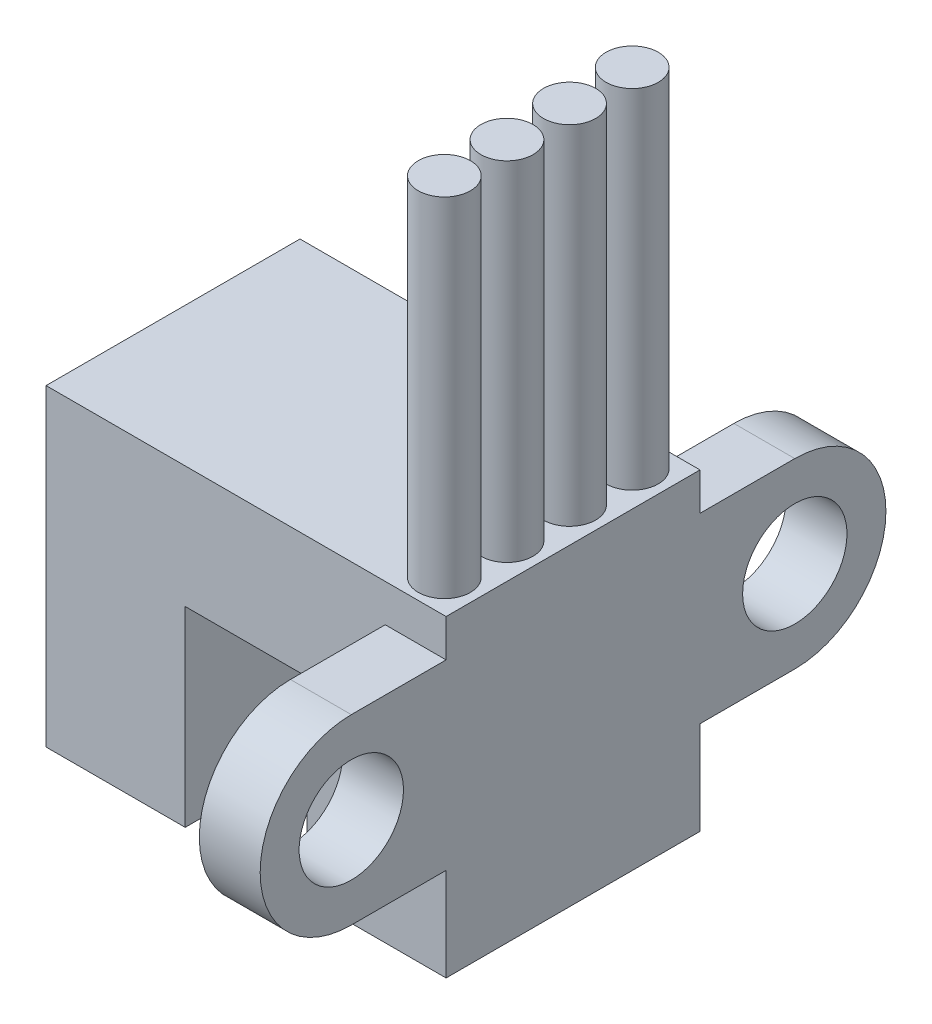
ISO-10303-21;
HEADER;
FILE_DESCRIPTION(('STEP AP214'),'2;1');
FILE_NAME('part.step','',(''),(''),'','','');
FILE_SCHEMA(('AUTOMOTIVE_DESIGN { 1 0 10303 214 1 1 1 1 }'));
ENDSEC;
DATA;
#1=APPLICATION_CONTEXT('core data for automotive mechanical design processes');
#2=APPLICATION_PROTOCOL_DEFINITION('international standard','automotive_design',2000,#1);
#3=PRODUCT_CONTEXT('',#1,'mechanical');
#4=PRODUCT('Part','Part','',(#3));
#5=PRODUCT_RELATED_PRODUCT_CATEGORY('part','',(#4));
#6=PRODUCT_DEFINITION_FORMATION('','',#4);
#7=PRODUCT_DEFINITION_CONTEXT('part definition',#1,'design');
#8=PRODUCT_DEFINITION('design','',#6,#7);
#9=PRODUCT_DEFINITION_SHAPE('','',#8);
#10=(LENGTH_UNIT() NAMED_UNIT(*) SI_UNIT(.MILLI.,.METRE.));
#11=(NAMED_UNIT(*) PLANE_ANGLE_UNIT() SI_UNIT($,.RADIAN.));
#12=(NAMED_UNIT(*) SI_UNIT($,.STERADIAN.) SOLID_ANGLE_UNIT());
#13=UNCERTAINTY_MEASURE_WITH_UNIT(LENGTH_MEASURE(1.E-05),#10,'distance_accuracy_value','');
#14=(GEOMETRIC_REPRESENTATION_CONTEXT(3) GLOBAL_UNCERTAINTY_ASSIGNED_CONTEXT((#13)) GLOBAL_UNIT_ASSIGNED_CONTEXT((#10,
#11,#12)) REPRESENTATION_CONTEXT('',''));
#15=CARTESIAN_POINT('',(0.,0.,0.));
#16=DIRECTION('',(0.,0.,1.));
#17=DIRECTION('',(1.,0.,0.));
#18=AXIS2_PLACEMENT_3D('',#15,#16,#17);
#19=CARTESIAN_POINT('',(0.,0.,3.65));
#20=DIRECTION('',(0.,0.,-1.));
#21=DIRECTION('',(-1.,0.,0.));
#22=AXIS2_PLACEMENT_3D('',#19,#20,#21);
#23=PLANE('',#22);
#24=DIRECTION('',(1.,0.,0.));
#25=VECTOR('',#24,1.);
#26=CARTESIAN_POINT('',(4.,-2.82,3.65));
#27=LINE('',#26,#25);
#28=CARTESIAN_POINT('',(4.,-2.82,3.65));
#29=VERTEX_POINT('',#28);
#30=CARTESIAN_POINT('',(5.75,-2.82,3.65));
#31=VERTEX_POINT('',#30);
#32=EDGE_CURVE('E218',#29,#31,#27,.T.);
#33=ORIENTED_EDGE('',*,*,#32,.F.);
#34=DIRECTION('',(0.,1.,0.));
#35=VECTOR('',#34,1.);
#36=CARTESIAN_POINT('',(4.,-2.82,3.65));
#37=LINE('',#36,#35);
#38=CARTESIAN_POINT('',(4.,2.42,3.65));
#39=VERTEX_POINT('',#38);
#40=EDGE_CURVE('E200',#29,#39,#37,.T.);
#41=ORIENTED_EDGE('',*,*,#40,.T.);
#42=DIRECTION('',(1.,0.,0.));
#43=VECTOR('',#42,1.);
#44=CARTESIAN_POINT('',(4.,2.42,3.65));
#45=LINE('',#44,#43);
#46=CARTESIAN_POINT('',(5.75,2.42,3.65));
#47=VERTEX_POINT('',#46);
#48=EDGE_CURVE('E216',#39,#47,#45,.T.);
#49=ORIENTED_EDGE('',*,*,#48,.T.);
#50=DIRECTION('',(0.,1.,0.));
#51=VECTOR('',#50,1.);
#52=CARTESIAN_POINT('',(5.75,-5.5,3.65));
#53=LINE('',#52,#51);
#54=CARTESIAN_POINT('',(5.75,3.5,3.65));
#55=VERTEX_POINT('',#54);
#56=EDGE_CURVE('E231',#47,#55,#53,.T.);
#57=ORIENTED_EDGE('',*,*,#56,.T.);
#58=DIRECTION('',(-1.,0.,0.));
#59=VECTOR('',#58,1.);
#60=CARTESIAN_POINT('',(-5.75,3.5,3.65));
#61=LINE('',#60,#59);
#62=CARTESIAN_POINT('',(-5.75,3.5,3.65));
#63=VERTEX_POINT('',#62);
#64=EDGE_CURVE('E235',#55,#63,#61,.T.);
#65=ORIENTED_EDGE('',*,*,#64,.T.);
#66=DIRECTION('',(0.,-1.,0.));
#67=VECTOR('',#66,1.);
#68=CARTESIAN_POINT('',(-5.75,-5.5,3.65));
#69=LINE('',#68,#67);
#70=CARTESIAN_POINT('',(-5.75,-5.5,3.65));
#71=VERTEX_POINT('',#70);
#72=EDGE_CURVE('E237',#63,#71,#69,.T.);
#73=ORIENTED_EDGE('',*,*,#72,.T.);
#74=DIRECTION('',(1.,0.,0.));
#75=VECTOR('',#74,1.);
#76=CARTESIAN_POINT('',(-1.75,-5.5,3.65));
#77=LINE('',#76,#75);
#78=CARTESIAN_POINT('',(-1.75,-5.5,3.65));
#79=VERTEX_POINT('',#78);
#80=EDGE_CURVE('E239',#71,#79,#77,.T.);
#81=ORIENTED_EDGE('',*,*,#80,.T.);
#82=DIRECTION('',(0.,1.,0.));
#83=VECTOR('',#82,1.);
#84=CARTESIAN_POINT('',(-1.75,0.,3.65));
#85=LINE('',#84,#83);
#86=CARTESIAN_POINT('',(-1.75,0.,3.65));
#87=VERTEX_POINT('',#86);
#88=EDGE_CURVE('E221',#79,#87,#85,.T.);
#89=ORIENTED_EDGE('',*,*,#88,.T.);
#90=DIRECTION('',(1.,0.,0.));
#91=VECTOR('',#90,1.);
#92=CARTESIAN_POINT('',(1.75,0.,3.65));
#93=LINE('',#92,#91);
#94=CARTESIAN_POINT('',(1.75,0.,3.65));
#95=VERTEX_POINT('',#94);
#96=EDGE_CURVE('E224',#87,#95,#93,.T.);
#97=ORIENTED_EDGE('',*,*,#96,.T.);
#98=DIRECTION('',(0.,-1.,0.));
#99=VECTOR('',#98,1.);
#100=CARTESIAN_POINT('',(1.75,0.,3.65));
#101=LINE('',#100,#99);
#102=CARTESIAN_POINT('',(1.75,-5.5,3.65));
#103=VERTEX_POINT('',#102);
#104=EDGE_CURVE('E227',#95,#103,#101,.T.);
#105=ORIENTED_EDGE('',*,*,#104,.T.);
#106=DIRECTION('',(1.,0.,0.));
#107=VECTOR('',#106,1.);
#108=CARTESIAN_POINT('',(1.75,-5.5,3.65));
#109=LINE('',#108,#107);
#110=CARTESIAN_POINT('',(5.75,-5.5,3.65));
#111=VERTEX_POINT('',#110);
#112=EDGE_CURVE('E229',#103,#111,#109,.T.);
#113=ORIENTED_EDGE('',*,*,#112,.T.);
#114=EDGE_CURVE('E232',#111,#31,#53,.T.);
#115=ORIENTED_EDGE('',*,*,#114,.T.);
#116=EDGE_LOOP('',(#33,#41,#49,#57,#65,#73,#81,#89,#97,#105,#113,#115));
#117=FACE_BOUND('',#116,.T.);
#118=ADVANCED_FACE('F32',(#117),#23,.F.);
#119=CARTESIAN_POINT('',(-1.75,0.,3.65));
#120=DIRECTION('',(-1.,0.,0.));
#121=DIRECTION('',(0.,-1.,0.));
#122=AXIS2_PLACEMENT_3D('',#119,#120,#121);
#123=PLANE('',#122);
#124=DIRECTION('',(0.,1.,0.));
#125=VECTOR('',#124,1.);
#126=CARTESIAN_POINT('',(-1.75,0.,-3.65));
#127=LINE('',#126,#125);
#128=CARTESIAN_POINT('',(-1.75,-5.5,-3.65));
#129=VERTEX_POINT('',#128);
#130=CARTESIAN_POINT('',(-1.75,0.,-3.65));
#131=VERTEX_POINT('',#130);
#132=EDGE_CURVE('E215',#129,#131,#127,.T.);
#133=ORIENTED_EDGE('',*,*,#132,.T.);
#134=DIRECTION('',(0.,0.,-1.));
#135=VECTOR('',#134,1.);
#136=CARTESIAN_POINT('',(-1.75,0.,3.65));
#137=LINE('',#136,#135);
#138=EDGE_CURVE('E279',#87,#131,#137,.T.);
#139=ORIENTED_EDGE('',*,*,#138,.F.);
#140=ORIENTED_EDGE('',*,*,#88,.F.);
#141=DIRECTION('',(0.,0.,-1.));
#142=VECTOR('',#141,1.);
#143=CARTESIAN_POINT('',(-1.75,-5.5,3.65));
#144=LINE('',#143,#142);
#145=EDGE_CURVE('E241',#79,#129,#144,.T.);
#146=ORIENTED_EDGE('',*,*,#145,.T.);
#147=EDGE_LOOP('',(#133,#139,#140,#146));
#148=FACE_BOUND('',#147,.T.);
#149=ADVANCED_FACE('F34',(#148),#123,.F.);
#150=CARTESIAN_POINT('',(1.75,0.,3.65));
#151=DIRECTION('',(0.,1.,0.));
#152=DIRECTION('',(0.,0.,1.));
#153=AXIS2_PLACEMENT_3D('',#150,#151,#152);
#154=PLANE('',#153);
#155=DIRECTION('',(1.,0.,0.));
#156=VECTOR('',#155,1.);
#157=CARTESIAN_POINT('',(1.75,0.,-3.65));
#158=LINE('',#157,#156);
#159=CARTESIAN_POINT('',(1.75,0.,-3.65));
#160=VERTEX_POINT('',#159);
#161=EDGE_CURVE('E244',#131,#160,#158,.T.);
#162=ORIENTED_EDGE('',*,*,#161,.T.);
#163=DIRECTION('',(0.,0.,-1.));
#164=VECTOR('',#163,1.);
#165=CARTESIAN_POINT('',(1.75,0.,3.65));
#166=LINE('',#165,#164);
#167=EDGE_CURVE('E276',#95,#160,#166,.T.);
#168=ORIENTED_EDGE('',*,*,#167,.F.);
#169=ORIENTED_EDGE('',*,*,#96,.F.);
#170=ORIENTED_EDGE('',*,*,#138,.T.);
#171=EDGE_LOOP('',(#162,#168,#169,#170));
#172=FACE_BOUND('',#171,.T.);
#173=ADVANCED_FACE('F342',(#172),#154,.F.);
#174=CARTESIAN_POINT('',(1.75,0.,3.65));
#175=DIRECTION('',(1.,0.,0.));
#176=DIRECTION('',(0.,1.,0.));
#177=AXIS2_PLACEMENT_3D('',#174,#175,#176);
#178=PLANE('',#177);
#179=DIRECTION('',(0.,-1.,0.));
#180=VECTOR('',#179,1.);
#181=CARTESIAN_POINT('',(1.75,0.,-3.65));
#182=LINE('',#181,#180);
#183=CARTESIAN_POINT('',(1.75,-5.5,-3.65));
#184=VERTEX_POINT('',#183);
#185=EDGE_CURVE('E246',#160,#184,#182,.T.);
#186=ORIENTED_EDGE('',*,*,#185,.T.);
#187=DIRECTION('',(0.,0.,-1.));
#188=VECTOR('',#187,1.);
#189=CARTESIAN_POINT('',(1.75,-5.5,3.65));
#190=LINE('',#189,#188);
#191=EDGE_CURVE('E273',#103,#184,#190,.T.);
#192=ORIENTED_EDGE('',*,*,#191,.F.);
#193=ORIENTED_EDGE('',*,*,#104,.F.);
#194=ORIENTED_EDGE('',*,*,#167,.T.);
#195=EDGE_LOOP('',(#186,#192,#193,#194));
#196=FACE_BOUND('',#195,.T.);
#197=ADVANCED_FACE('F339',(#196),#178,.F.);
#198=CARTESIAN_POINT('',(1.75,-5.5,3.65));
#199=DIRECTION('',(0.,1.,0.));
#200=DIRECTION('',(-1.,0.,0.));
#201=AXIS2_PLACEMENT_3D('',#198,#199,#200);
#202=PLANE('',#201);
#203=DIRECTION('',(1.,0.,0.));
#204=VECTOR('',#203,1.);
#205=CARTESIAN_POINT('',(1.75,-5.5,-3.65));
#206=LINE('',#205,#204);
#207=CARTESIAN_POINT('',(5.75,-5.5,-3.65));
#208=VERTEX_POINT('',#207);
#209=EDGE_CURVE('E248',#184,#208,#206,.T.);
#210=ORIENTED_EDGE('',*,*,#209,.T.);
#211=DIRECTION('',(0.,0.,-1.));
#212=VECTOR('',#211,1.);
#213=CARTESIAN_POINT('',(5.75,-5.5,3.65));
#214=LINE('',#213,#212);
#215=EDGE_CURVE('E270',#111,#208,#214,.T.);
#216=ORIENTED_EDGE('',*,*,#215,.F.);
#217=ORIENTED_EDGE('',*,*,#112,.F.);
#218=ORIENTED_EDGE('',*,*,#191,.T.);
#219=EDGE_LOOP('',(#210,#216,#217,#218));
#220=FACE_BOUND('',#219,.T.);
#221=ADVANCED_FACE('F335',(#220),#202,.F.);
#222=CARTESIAN_POINT('',(5.75,-5.5,3.65));
#223=DIRECTION('',(-1.,0.,0.));
#224=DIRECTION('',(0.,0.,1.));
#225=AXIS2_PLACEMENT_3D('',#222,#223,#224);
#226=PLANE('',#225);
#227=DIRECTION('',(0.,1.,0.));
#228=VECTOR('',#227,1.);
#229=CARTESIAN_POINT('',(5.75,-5.5,-3.65));
#230=LINE('',#229,#228);
#231=CARTESIAN_POINT('',(5.75,-2.82,-3.65));
#232=VERTEX_POINT('',#231);
#233=EDGE_CURVE('E251',#208,#232,#230,.T.);
#234=ORIENTED_EDGE('',*,*,#233,.T.);
#235=DIRECTION('',(0.,0.,1.));
#236=VECTOR('',#235,1.);
#237=CARTESIAN_POINT('',(5.75,-2.82,-6.375));
#238=LINE('',#237,#236);
#239=CARTESIAN_POINT('',(5.75,-2.82,-6.375));
#240=VERTEX_POINT('',#239);
#241=EDGE_CURVE('E47',#240,#232,#238,.T.);
#242=ORIENTED_EDGE('',*,*,#241,.F.);
#243=CARTESIAN_POINT('',(5.75,-0.200000000000001,-6.375));
#244=DIRECTION('',(-1.,0.,0.));
#245=DIRECTION('',(0.,0.,1.));
#246=AXIS2_PLACEMENT_3D('',#243,#244,#245);
#247=CIRCLE('',#246,2.62);
#248=CARTESIAN_POINT('',(5.75,2.42,-6.375));
#249=VERTEX_POINT('',#248);
#250=EDGE_CURVE('E179',#249,#240,#247,.T.);
#251=ORIENTED_EDGE('',*,*,#250,.F.);
#252=DIRECTION('',(0.,0.,-1.));
#253=VECTOR('',#252,1.);
#254=CARTESIAN_POINT('',(5.75,2.42,-6.375));
#255=LINE('',#254,#253);
#256=CARTESIAN_POINT('',(5.75,2.42,-3.65));
#257=VERTEX_POINT('',#256);
#258=EDGE_CURVE('E162',#257,#249,#255,.T.);
#259=ORIENTED_EDGE('',*,*,#258,.F.);
#260=CARTESIAN_POINT('',(5.75,3.5,-3.65));
#261=VERTEX_POINT('',#260);
#262=EDGE_CURVE('E250',#257,#261,#230,.T.);
#263=ORIENTED_EDGE('',*,*,#262,.T.);
#264=DIRECTION('',(0.,0.,-1.));
#265=VECTOR('',#264,1.);
#266=CARTESIAN_POINT('',(5.75,3.5,3.65));
#267=LINE('',#266,#265);
#268=EDGE_CURVE('E267',#55,#261,#267,.T.);
#269=ORIENTED_EDGE('',*,*,#268,.F.);
#270=ORIENTED_EDGE('',*,*,#56,.F.);
#271=DIRECTION('',(0.,0.,1.));
#272=VECTOR('',#271,1.);
#273=CARTESIAN_POINT('',(5.75,2.42,6.375));
#274=LINE('',#273,#272);
#275=CARTESIAN_POINT('',(5.75,2.42,6.375));
#276=VERTEX_POINT('',#275);
#277=EDGE_CURVE('E55',#47,#276,#274,.T.);
#278=ORIENTED_EDGE('',*,*,#277,.T.);
#279=CARTESIAN_POINT('',(5.75,-0.200000000000001,6.375));
#280=DIRECTION('',(1.,0.,0.));
#281=DIRECTION('',(0.,0.,-1.));
#282=AXIS2_PLACEMENT_3D('',#279,#280,#281);
#283=CIRCLE('',#282,2.62);
#284=CARTESIAN_POINT('',(5.75,-2.82,6.375));
#285=VERTEX_POINT('',#284);
#286=EDGE_CURVE('E191',#276,#285,#283,.T.);
#287=ORIENTED_EDGE('',*,*,#286,.T.);
#288=DIRECTION('',(0.,0.,-1.));
#289=VECTOR('',#288,1.);
#290=CARTESIAN_POINT('',(5.75,-2.82,6.375));
#291=LINE('',#290,#289);
#292=EDGE_CURVE('E209',#285,#31,#291,.T.);
#293=ORIENTED_EDGE('',*,*,#292,.T.);
#294=ORIENTED_EDGE('',*,*,#114,.F.);
#295=ORIENTED_EDGE('',*,*,#215,.T.);
#296=EDGE_LOOP('',(#234,#242,#251,#259,#263,#269,#270,#278,#287,#293,#294,#295));
#297=FACE_BOUND('',#296,.T.);
#298=CARTESIAN_POINT('',(5.75,-0.200000000000001,6.375));
#299=DIRECTION('',(1.,0.,0.));
#300=DIRECTION('',(0.,0.,-1.));
#301=AXIS2_PLACEMENT_3D('',#298,#299,#300);
#302=CIRCLE('',#301,1.5);
#303=CARTESIAN_POINT('',(5.75,-0.200000000000001,4.875));
#304=VERTEX_POINT('',#303);
#305=EDGE_CURVE('E184',#304,#304,#302,.T.);
#306=ORIENTED_EDGE('',*,*,#305,.F.);
#307=EDGE_LOOP('',(#306));
#308=FACE_BOUND('',#307,.T.);
#309=CARTESIAN_POINT('',(5.75,-0.200000000000001,-6.375));
#310=DIRECTION('',(-1.,0.,0.));
#311=DIRECTION('',(0.,0.,1.));
#312=AXIS2_PLACEMENT_3D('',#309,#310,#311);
#313=CIRCLE('',#312,1.5);
#314=CARTESIAN_POINT('',(5.75,-0.200000000000001,-4.875));
#315=VERTEX_POINT('',#314);
#316=EDGE_CURVE('E174',#315,#315,#313,.T.);
#317=ORIENTED_EDGE('',*,*,#316,.T.);
#318=EDGE_LOOP('',(#317));
#319=FACE_BOUND('',#318,.T.);
#320=ADVANCED_FACE('F296',(#297,#308,#319),#226,.F.);
#321=CARTESIAN_POINT('',(-5.75,3.5,3.65));
#322=DIRECTION('',(0.,-1.,0.));
#323=DIRECTION('',(1.,0.,0.));
#324=AXIS2_PLACEMENT_3D('',#321,#322,#323);
#325=PLANE('',#324);
#326=CARTESIAN_POINT('',(4.75,3.5,2.7));
#327=DIRECTION('',(0.,-1.,0.));
#328=DIRECTION('',(1.,0.,0.));
#329=AXIS2_PLACEMENT_3D('',#326,#327,#328);
#330=CIRCLE('',#329,0.750000000000001);
#331=CARTESIAN_POINT('',(5.5,3.5,2.7));
#332=VERTEX_POINT('',#331);
#333=EDGE_CURVE('E11',#332,#332,#330,.F.);
#334=ORIENTED_EDGE('',*,*,#333,.F.);
#335=EDGE_LOOP('',(#334));
#336=FACE_BOUND('',#335,.T.);
#337=CARTESIAN_POINT('',(4.75,3.5,0.9));
#338=DIRECTION('',(0.,-1.,0.));
#339=DIRECTION('',(1.,0.,0.));
#340=AXIS2_PLACEMENT_3D('',#337,#338,#339);
#341=CIRCLE('',#340,0.75);
#342=CARTESIAN_POINT('',(5.5,3.5,0.9));
#343=VERTEX_POINT('',#342);
#344=EDGE_CURVE('E40',#343,#343,#341,.F.);
#345=ORIENTED_EDGE('',*,*,#344,.F.);
#346=EDGE_LOOP('',(#345));
#347=FACE_BOUND('',#346,.T.);
#348=CARTESIAN_POINT('',(4.75,3.5,-0.9));
#349=DIRECTION('',(0.,-1.,0.));
#350=DIRECTION('',(1.,0.,0.));
#351=AXIS2_PLACEMENT_3D('',#348,#349,#350);
#352=CIRCLE('',#351,0.75);
#353=CARTESIAN_POINT('',(5.5,3.5,-0.9));
#354=VERTEX_POINT('',#353);
#355=EDGE_CURVE('E285',#354,#354,#352,.F.);
#356=ORIENTED_EDGE('',*,*,#355,.F.);
#357=EDGE_LOOP('',(#356));
#358=FACE_BOUND('',#357,.T.);
#359=CARTESIAN_POINT('',(4.75,3.5,-2.7));
#360=DIRECTION('',(0.,-1.,0.));
#361=DIRECTION('',(1.,0.,0.));
#362=AXIS2_PLACEMENT_3D('',#359,#360,#361);
#363=CIRCLE('',#362,0.750000000000001);
#364=CARTESIAN_POINT('',(5.5,3.5,-2.7));
#365=VERTEX_POINT('',#364);
#366=EDGE_CURVE('E282',#365,#365,#363,.F.);
#367=ORIENTED_EDGE('',*,*,#366,.F.);
#368=EDGE_LOOP('',(#367));
#369=FACE_BOUND('',#368,.T.);
#370=DIRECTION('',(-1.,0.,0.));
#371=VECTOR('',#370,1.);
#372=CARTESIAN_POINT('',(-5.75,3.5,-3.65));
#373=LINE('',#372,#371);
#374=CARTESIAN_POINT('',(-5.75,3.5,-3.65));
#375=VERTEX_POINT('',#374);
#376=EDGE_CURVE('E254',#261,#375,#373,.T.);
#377=ORIENTED_EDGE('',*,*,#376,.T.);
#378=DIRECTION('',(0.,0.,-1.));
#379=VECTOR('',#378,1.);
#380=CARTESIAN_POINT('',(-5.75,3.5,3.65));
#381=LINE('',#380,#379);
#382=EDGE_CURVE('E264',#63,#375,#381,.T.);
#383=ORIENTED_EDGE('',*,*,#382,.F.);
#384=ORIENTED_EDGE('',*,*,#64,.F.);
#385=ORIENTED_EDGE('',*,*,#268,.T.);
#386=EDGE_LOOP('',(#377,#383,#384,#385));
#387=FACE_BOUND('',#386,.T.);
#388=ADVANCED_FACE('F292',(#336,#347,#358,#369,#387),#325,.F.);
#389=CARTESIAN_POINT('',(-5.75,-5.5,3.65));
#390=DIRECTION('',(1.,0.,0.));
#391=DIRECTION('',(0.,0.,-1.));
#392=AXIS2_PLACEMENT_3D('',#389,#390,#391);
#393=PLANE('',#392);
#394=DIRECTION('',(0.,-1.,0.));
#395=VECTOR('',#394,1.);
#396=CARTESIAN_POINT('',(-5.75,-5.5,-3.65));
#397=LINE('',#396,#395);
#398=CARTESIAN_POINT('',(-5.75,-5.5,-3.65));
#399=VERTEX_POINT('',#398);
#400=EDGE_CURVE('E256',#375,#399,#397,.T.);
#401=ORIENTED_EDGE('',*,*,#400,.T.);
#402=DIRECTION('',(0.,0.,-1.));
#403=VECTOR('',#402,1.);
#404=CARTESIAN_POINT('',(-5.75,-5.5,3.65));
#405=LINE('',#404,#403);
#406=EDGE_CURVE('E261',#71,#399,#405,.T.);
#407=ORIENTED_EDGE('',*,*,#406,.F.);
#408=ORIENTED_EDGE('',*,*,#72,.F.);
#409=ORIENTED_EDGE('',*,*,#382,.T.);
#410=EDGE_LOOP('',(#401,#407,#408,#409));
#411=FACE_BOUND('',#410,.T.);
#412=ADVANCED_FACE('F295',(#411),#393,.F.);
#413=CARTESIAN_POINT('',(-1.75,-5.5,3.65));
#414=DIRECTION('',(0.,1.,0.));
#415=DIRECTION('',(-1.,0.,0.));
#416=AXIS2_PLACEMENT_3D('',#413,#414,#415);
#417=PLANE('',#416);
#418=DIRECTION('',(1.,0.,0.));
#419=VECTOR('',#418,1.);
#420=CARTESIAN_POINT('',(-1.75,-5.5,-3.65));
#421=LINE('',#420,#419);
#422=EDGE_CURVE('E225',#399,#129,#421,.T.);
#423=ORIENTED_EDGE('',*,*,#422,.T.);
#424=ORIENTED_EDGE('',*,*,#145,.F.);
#425=ORIENTED_EDGE('',*,*,#80,.F.);
#426=ORIENTED_EDGE('',*,*,#406,.T.);
#427=EDGE_LOOP('',(#423,#424,#425,#426));
#428=FACE_BOUND('',#427,.T.);
#429=ADVANCED_FACE('F318',(#428),#417,.F.);
#430=CARTESIAN_POINT('',(0.,0.,-3.65));
#431=DIRECTION('',(0.,0.,-1.));
#432=DIRECTION('',(-1.,0.,0.));
#433=AXIS2_PLACEMENT_3D('',#430,#431,#432);
#434=PLANE('',#433);
#435=DIRECTION('',(1.,0.,0.));
#436=VECTOR('',#435,1.);
#437=CARTESIAN_POINT('',(4.,2.42,-3.65));
#438=LINE('',#437,#436);
#439=CARTESIAN_POINT('',(4.,2.42,-3.65));
#440=VERTEX_POINT('',#439);
#441=EDGE_CURVE('E166',#440,#257,#438,.T.);
#442=ORIENTED_EDGE('',*,*,#441,.F.);
#443=DIRECTION('',(0.,1.,0.));
#444=VECTOR('',#443,1.);
#445=CARTESIAN_POINT('',(4.,-2.82,-3.65));
#446=LINE('',#445,#444);
#447=CARTESIAN_POINT('',(4.,-2.82,-3.65));
#448=VERTEX_POINT('',#447);
#449=EDGE_CURVE('E154',#448,#440,#446,.T.);
#450=ORIENTED_EDGE('',*,*,#449,.F.);
#451=DIRECTION('',(1.,0.,0.));
#452=VECTOR('',#451,1.);
#453=CARTESIAN_POINT('',(4.,-2.82,-3.65));
#454=LINE('',#453,#452);
#455=EDGE_CURVE('E185',#448,#232,#454,.T.);
#456=ORIENTED_EDGE('',*,*,#455,.T.);
#457=ORIENTED_EDGE('',*,*,#233,.F.);
#458=ORIENTED_EDGE('',*,*,#209,.F.);
#459=ORIENTED_EDGE('',*,*,#185,.F.);
#460=ORIENTED_EDGE('',*,*,#161,.F.);
#461=ORIENTED_EDGE('',*,*,#132,.F.);
#462=ORIENTED_EDGE('',*,*,#422,.F.);
#463=ORIENTED_EDGE('',*,*,#400,.F.);
#464=ORIENTED_EDGE('',*,*,#376,.F.);
#465=ORIENTED_EDGE('',*,*,#262,.F.);
#466=EDGE_LOOP('',(#442,#450,#456,#457,#458,#459,#460,#461,#462,#463,#464,#465));
#467=FACE_BOUND('',#466,.T.);
#468=ADVANCED_FACE('F314',(#467),#434,.T.);
#469=CARTESIAN_POINT('',(4.,-0.200000000000001,6.375));
#470=DIRECTION('',(1.,0.,0.));
#471=DIRECTION('',(0.,0.,-1.));
#472=AXIS2_PLACEMENT_3D('',#469,#470,#471);
#473=CYLINDRICAL_SURFACE('',#472,2.62);
#474=ORIENTED_EDGE('',*,*,#286,.F.);
#475=DIRECTION('',(1.,0.,0.));
#476=VECTOR('',#475,1.);
#477=CARTESIAN_POINT('',(4.,2.42,6.375));
#478=LINE('',#477,#476);
#479=CARTESIAN_POINT('',(4.,2.42,6.375));
#480=VERTEX_POINT('',#479);
#481=EDGE_CURVE('E213',#480,#276,#478,.T.);
#482=ORIENTED_EDGE('',*,*,#481,.F.);
#483=CARTESIAN_POINT('',(4.,-0.200000000000001,6.375));
#484=DIRECTION('',(1.,0.,0.));
#485=DIRECTION('',(0.,0.,-1.));
#486=AXIS2_PLACEMENT_3D('',#483,#484,#485);
#487=CIRCLE('',#486,2.62);
#488=CARTESIAN_POINT('',(4.,-2.82,6.375));
#489=VERTEX_POINT('',#488);
#490=EDGE_CURVE('E194',#480,#489,#487,.T.);
#491=ORIENTED_EDGE('',*,*,#490,.T.);
#492=DIRECTION('',(1.,0.,0.));
#493=VECTOR('',#492,1.);
#494=CARTESIAN_POINT('',(4.,-2.82,6.375));
#495=LINE('',#494,#493);
#496=EDGE_CURVE('E206',#489,#285,#495,.T.);
#497=ORIENTED_EDGE('',*,*,#496,.T.);
#498=EDGE_LOOP('',(#474,#482,#491,#497));
#499=FACE_BOUND('',#498,.T.);
#500=ADVANCED_FACE('F355',(#499),#473,.T.);
#501=CARTESIAN_POINT('',(4.,2.42,6.375));
#502=DIRECTION('',(0.,1.,0.));
#503=DIRECTION('',(0.,0.,1.));
#504=AXIS2_PLACEMENT_3D('',#501,#502,#503);
#505=PLANE('',#504);
#506=ORIENTED_EDGE('',*,*,#277,.F.);
#507=ORIENTED_EDGE('',*,*,#48,.F.);
#508=DIRECTION('',(0.,0.,1.));
#509=VECTOR('',#508,1.);
#510=CARTESIAN_POINT('',(4.,2.42,6.375));
#511=LINE('',#510,#509);
#512=EDGE_CURVE('E203',#39,#480,#511,.T.);
#513=ORIENTED_EDGE('',*,*,#512,.T.);
#514=ORIENTED_EDGE('',*,*,#481,.T.);
#515=EDGE_LOOP('',(#506,#507,#513,#514));
#516=FACE_BOUND('',#515,.T.);
#517=ADVANCED_FACE('F400',(#516),#505,.T.);
#518=CARTESIAN_POINT('',(4.,-2.82,6.375));
#519=DIRECTION('',(0.,-1.,0.));
#520=DIRECTION('',(0.,0.,-1.));
#521=AXIS2_PLACEMENT_3D('',#518,#519,#520);
#522=PLANE('',#521);
#523=ORIENTED_EDGE('',*,*,#292,.F.);
#524=ORIENTED_EDGE('',*,*,#496,.F.);
#525=DIRECTION('',(0.,0.,-1.));
#526=VECTOR('',#525,1.);
#527=CARTESIAN_POINT('',(4.,-2.82,6.375));
#528=LINE('',#527,#526);
#529=EDGE_CURVE('E197',#489,#29,#528,.T.);
#530=ORIENTED_EDGE('',*,*,#529,.T.);
#531=ORIENTED_EDGE('',*,*,#32,.T.);
#532=EDGE_LOOP('',(#523,#524,#530,#531));
#533=FACE_BOUND('',#532,.T.);
#534=ADVANCED_FACE('F407',(#533),#522,.T.);
#535=CARTESIAN_POINT('',(4.,-0.200000000000001,6.375));
#536=DIRECTION('',(1.,0.,0.));
#537=DIRECTION('',(0.,0.,-1.));
#538=AXIS2_PLACEMENT_3D('',#535,#536,#537);
#539=PLANE('',#538);
#540=CARTESIAN_POINT('',(4.,-0.200000000000001,6.375));
#541=DIRECTION('',(1.,0.,0.));
#542=DIRECTION('',(0.,0.,-1.));
#543=AXIS2_PLACEMENT_3D('',#540,#541,#542);
#544=CIRCLE('',#543,1.5);
#545=CARTESIAN_POINT('',(4.,-0.200000000000001,4.875));
#546=VERTEX_POINT('',#545);
#547=EDGE_CURVE('E188',#546,#546,#544,.T.);
#548=ORIENTED_EDGE('',*,*,#547,.T.);
#549=EDGE_LOOP('',(#548));
#550=FACE_BOUND('',#549,.T.);
#551=ORIENTED_EDGE('',*,*,#490,.F.);
#552=ORIENTED_EDGE('',*,*,#512,.F.);
#553=ORIENTED_EDGE('',*,*,#40,.F.);
#554=ORIENTED_EDGE('',*,*,#529,.F.);
#555=EDGE_LOOP('',(#551,#552,#553,#554));
#556=FACE_BOUND('',#555,.T.);
#557=ADVANCED_FACE('F414',(#550,#556),#539,.F.);
#558=CARTESIAN_POINT('',(4.,-0.200000000000001,6.375));
#559=DIRECTION('',(1.,0.,0.));
#560=DIRECTION('',(0.,0.,-1.));
#561=AXIS2_PLACEMENT_3D('',#558,#559,#560);
#562=CYLINDRICAL_SURFACE('',#561,1.5);
#563=ORIENTED_EDGE('',*,*,#547,.F.);
#564=EDGE_LOOP('',(#563));
#565=FACE_BOUND('',#564,.T.);
#566=ORIENTED_EDGE('',*,*,#305,.T.);
#567=EDGE_LOOP('',(#566));
#568=FACE_BOUND('',#567,.T.);
#569=ADVANCED_FACE('F421',(#565,#568),#562,.F.);
#570=CARTESIAN_POINT('',(4.,-0.200000000000001,-6.375));
#571=DIRECTION('',(1.,0.,0.));
#572=DIRECTION('',(0.,0.,1.));
#573=AXIS2_PLACEMENT_3D('',#570,#571,#572);
#574=PLANE('',#573);
#575=CARTESIAN_POINT('',(4.,-0.200000000000001,-6.375));
#576=DIRECTION('',(-1.,0.,0.));
#577=DIRECTION('',(0.,0.,1.));
#578=AXIS2_PLACEMENT_3D('',#575,#576,#577);
#579=CIRCLE('',#578,2.62);
#580=CARTESIAN_POINT('',(4.,2.42,-6.375));
#581=VERTEX_POINT('',#580);
#582=CARTESIAN_POINT('',(4.,-2.82,-6.375));
#583=VERTEX_POINT('',#582);
#584=EDGE_CURVE('E151',#581,#583,#579,.T.);
#585=ORIENTED_EDGE('',*,*,#584,.T.);
#586=DIRECTION('',(0.,0.,1.));
#587=VECTOR('',#586,1.);
#588=CARTESIAN_POINT('',(4.,-2.82,-6.375));
#589=LINE('',#588,#587);
#590=EDGE_CURVE('E167',#583,#448,#589,.T.);
#591=ORIENTED_EDGE('',*,*,#590,.T.);
#592=ORIENTED_EDGE('',*,*,#449,.T.);
#593=DIRECTION('',(0.,0.,-1.));
#594=VECTOR('',#593,1.);
#595=CARTESIAN_POINT('',(4.,2.42,-6.375));
#596=LINE('',#595,#594);
#597=EDGE_CURVE('E146',#440,#581,#596,.T.);
#598=ORIENTED_EDGE('',*,*,#597,.T.);
#599=EDGE_LOOP('',(#585,#591,#592,#598));
#600=FACE_BOUND('',#599,.T.);
#601=CARTESIAN_POINT('',(4.,-0.200000000000001,-6.375));
#602=DIRECTION('',(-1.,0.,0.));
#603=DIRECTION('',(0.,0.,1.));
#604=AXIS2_PLACEMENT_3D('',#601,#602,#603);
#605=CIRCLE('',#604,1.5);
#606=CARTESIAN_POINT('',(4.,-0.200000000000001,-4.875));
#607=VERTEX_POINT('',#606);
#608=EDGE_CURVE('E181',#607,#607,#605,.T.);
#609=ORIENTED_EDGE('',*,*,#608,.F.);
#610=EDGE_LOOP('',(#609));
#611=FACE_BOUND('',#610,.T.);
#612=ADVANCED_FACE('F148',(#600,#611),#574,.F.);
#613=CARTESIAN_POINT('',(4.,-0.200000000000001,-6.375));
#614=DIRECTION('',(1.,0.,0.));
#615=DIRECTION('',(0.,0.,-1.));
#616=AXIS2_PLACEMENT_3D('',#613,#614,#615);
#617=CYLINDRICAL_SURFACE('',#616,2.62);
#618=ORIENTED_EDGE('',*,*,#250,.T.);
#619=DIRECTION('',(1.,0.,0.));
#620=VECTOR('',#619,1.);
#621=CARTESIAN_POINT('',(4.,-2.82,-6.375));
#622=LINE('',#621,#620);
#623=EDGE_CURVE('E170',#583,#240,#622,.T.);
#624=ORIENTED_EDGE('',*,*,#623,.F.);
#625=ORIENTED_EDGE('',*,*,#584,.F.);
#626=DIRECTION('',(1.,0.,0.));
#627=VECTOR('',#626,1.);
#628=CARTESIAN_POINT('',(4.,2.42,-6.375));
#629=LINE('',#628,#627);
#630=EDGE_CURVE('E159',#581,#249,#629,.T.);
#631=ORIENTED_EDGE('',*,*,#630,.T.);
#632=EDGE_LOOP('',(#618,#624,#625,#631));
#633=FACE_BOUND('',#632,.T.);
#634=ADVANCED_FACE('F169',(#633),#617,.T.);
#635=CARTESIAN_POINT('',(4.,-2.82,-6.375));
#636=DIRECTION('',(0.,1.,0.));
#637=DIRECTION('',(0.,0.,1.));
#638=AXIS2_PLACEMENT_3D('',#635,#636,#637);
#639=PLANE('',#638);
#640=ORIENTED_EDGE('',*,*,#241,.T.);
#641=ORIENTED_EDGE('',*,*,#455,.F.);
#642=ORIENTED_EDGE('',*,*,#590,.F.);
#643=ORIENTED_EDGE('',*,*,#623,.T.);
#644=EDGE_LOOP('',(#640,#641,#642,#643));
#645=FACE_BOUND('',#644,.T.);
#646=ADVANCED_FACE('F440',(#645),#639,.F.);
#647=CARTESIAN_POINT('',(4.,2.42,-6.375));
#648=DIRECTION('',(0.,-1.,0.));
#649=DIRECTION('',(0.,0.,-1.));
#650=AXIS2_PLACEMENT_3D('',#647,#648,#649);
#651=PLANE('',#650);
#652=ORIENTED_EDGE('',*,*,#258,.T.);
#653=ORIENTED_EDGE('',*,*,#630,.F.);
#654=ORIENTED_EDGE('',*,*,#597,.F.);
#655=ORIENTED_EDGE('',*,*,#441,.T.);
#656=EDGE_LOOP('',(#652,#653,#654,#655));
#657=FACE_BOUND('',#656,.T.);
#658=ADVANCED_FACE('F160',(#657),#651,.F.);
#659=CARTESIAN_POINT('',(4.,-0.200000000000001,-6.375));
#660=DIRECTION('',(1.,0.,0.));
#661=DIRECTION('',(0.,0.,-1.));
#662=AXIS2_PLACEMENT_3D('',#659,#660,#661);
#663=CYLINDRICAL_SURFACE('',#662,1.5);
#664=ORIENTED_EDGE('',*,*,#608,.T.);
#665=EDGE_LOOP('',(#664));
#666=FACE_BOUND('',#665,.T.);
#667=ORIENTED_EDGE('',*,*,#316,.F.);
#668=EDGE_LOOP('',(#667));
#669=FACE_BOUND('',#668,.T.);
#670=ADVANCED_FACE('F453',(#666,#669),#663,.F.);
#671=CARTESIAN_POINT('',(4.75,13.5,-2.7));
#672=DIRECTION('',(0.,-1.,0.));
#673=DIRECTION('',(1.,0.,0.));
#674=AXIS2_PLACEMENT_3D('',#671,#672,#673);
#675=CYLINDRICAL_SURFACE('',#674,0.750000000000001);
#676=CARTESIAN_POINT('',(4.75,13.5,-2.7));
#677=DIRECTION('',(0.,1.,0.));
#678=DIRECTION('',(-1.,0.,0.));
#679=AXIS2_PLACEMENT_3D('',#676,#677,#678);
#680=CIRCLE('',#679,0.750000000000001);
#681=CARTESIAN_POINT('',(4.,13.5,-2.7));
#682=VERTEX_POINT('',#681);
#683=EDGE_CURVE('E607',#682,#682,#680,.T.);
#684=ORIENTED_EDGE('',*,*,#683,.F.);
#685=EDGE_LOOP('',(#684));
#686=FACE_BOUND('',#685,.T.);
#687=ORIENTED_EDGE('',*,*,#366,.T.);
#688=EDGE_LOOP('',(#687));
#689=FACE_BOUND('',#688,.T.);
#690=ADVANCED_FACE('F459',(#686,#689),#675,.T.);
#691=CARTESIAN_POINT('',(4.75,13.5,-2.7));
#692=DIRECTION('',(0.,1.,0.));
#693=DIRECTION('',(-1.,0.,0.));
#694=AXIS2_PLACEMENT_3D('',#691,#692,#693);
#695=PLANE('',#694);
#696=ORIENTED_EDGE('',*,*,#683,.T.);
#697=EDGE_LOOP('',(#696));
#698=FACE_BOUND('',#697,.T.);
#699=ADVANCED_FACE('F466',(#698),#695,.T.);
#700=CARTESIAN_POINT('',(4.75,13.5,-0.9));
#701=DIRECTION('',(0.,-1.,0.));
#702=DIRECTION('',(1.,0.,0.));
#703=AXIS2_PLACEMENT_3D('',#700,#701,#702);
#704=CYLINDRICAL_SURFACE('',#703,0.75);
#705=CARTESIAN_POINT('',(4.75,13.5,-0.9));
#706=DIRECTION('',(0.,1.,0.));
#707=DIRECTION('',(-1.,0.,0.));
#708=AXIS2_PLACEMENT_3D('',#705,#706,#707);
#709=CIRCLE('',#708,0.75);
#710=CARTESIAN_POINT('',(4.,13.5,-0.9));
#711=VERTEX_POINT('',#710);
#712=EDGE_CURVE('E602',#711,#711,#709,.T.);
#713=ORIENTED_EDGE('',*,*,#712,.F.);
#714=EDGE_LOOP('',(#713));
#715=FACE_BOUND('',#714,.T.);
#716=ORIENTED_EDGE('',*,*,#355,.T.);
#717=EDGE_LOOP('',(#716));
#718=FACE_BOUND('',#717,.T.);
#719=ADVANCED_FACE('F474',(#715,#718),#704,.T.);
#720=CARTESIAN_POINT('',(4.75,13.5,-0.9));
#721=DIRECTION('',(0.,1.,0.));
#722=DIRECTION('',(-1.,0.,0.));
#723=AXIS2_PLACEMENT_3D('',#720,#721,#722);
#724=PLANE('',#723);
#725=ORIENTED_EDGE('',*,*,#712,.T.);
#726=EDGE_LOOP('',(#725));
#727=FACE_BOUND('',#726,.T.);
#728=ADVANCED_FACE('F482',(#727),#724,.T.);
#729=CARTESIAN_POINT('',(4.75,13.5,0.9));
#730=DIRECTION('',(0.,-1.,0.));
#731=DIRECTION('',(1.,0.,0.));
#732=AXIS2_PLACEMENT_3D('',#729,#730,#731);
#733=CYLINDRICAL_SURFACE('',#732,0.75);
#734=CARTESIAN_POINT('',(4.75,13.5,0.9));
#735=DIRECTION('',(0.,1.,0.));
#736=DIRECTION('',(1.,0.,0.));
#737=AXIS2_PLACEMENT_3D('',#734,#735,#736);
#738=CIRCLE('',#737,0.75);
#739=CARTESIAN_POINT('',(5.5,13.5,0.9));
#740=VERTEX_POINT('',#739);
#741=EDGE_CURVE('E599',#740,#740,#738,.T.);
#742=ORIENTED_EDGE('',*,*,#741,.F.);
#743=EDGE_LOOP('',(#742));
#744=FACE_BOUND('',#743,.T.);
#745=ORIENTED_EDGE('',*,*,#344,.T.);
#746=EDGE_LOOP('',(#745));
#747=FACE_BOUND('',#746,.T.);
#748=ADVANCED_FACE('F290',(#744,#747),#733,.T.);
#749=CARTESIAN_POINT('',(4.75,13.5,0.9));
#750=DIRECTION('',(0.,-1.,0.));
#751=DIRECTION('',(1.,0.,0.));
#752=AXIS2_PLACEMENT_3D('',#749,#750,#751);
#753=PLANE('',#752);
#754=ORIENTED_EDGE('',*,*,#741,.T.);
#755=EDGE_LOOP('',(#754));
#756=FACE_BOUND('',#755,.T.);
#757=ADVANCED_FACE('F497',(#756),#753,.F.);
#758=CARTESIAN_POINT('',(4.75,13.5,2.7));
#759=DIRECTION('',(0.,-1.,0.));
#760=DIRECTION('',(1.,0.,0.));
#761=AXIS2_PLACEMENT_3D('',#758,#759,#760);
#762=CYLINDRICAL_SURFACE('',#761,0.750000000000001);
#763=CARTESIAN_POINT('',(4.75,13.5,2.7));
#764=DIRECTION('',(0.,1.,0.));
#765=DIRECTION('',(1.,0.,0.));
#766=AXIS2_PLACEMENT_3D('',#763,#764,#765);
#767=CIRCLE('',#766,0.750000000000001);
#768=CARTESIAN_POINT('',(5.5,13.5,2.7));
#769=VERTEX_POINT('',#768);
#770=EDGE_CURVE('E598',#769,#769,#767,.T.);
#771=ORIENTED_EDGE('',*,*,#770,.F.);
#772=EDGE_LOOP('',(#771));
#773=FACE_BOUND('',#772,.T.);
#774=ORIENTED_EDGE('',*,*,#333,.T.);
#775=EDGE_LOOP('',(#774));
#776=FACE_BOUND('',#775,.T.);
#777=ADVANCED_FACE('F505',(#773,#776),#762,.T.);
#778=CARTESIAN_POINT('',(4.75,13.5,2.7));
#779=DIRECTION('',(0.,-1.,0.));
#780=DIRECTION('',(1.,0.,0.));
#781=AXIS2_PLACEMENT_3D('',#778,#779,#780);
#782=PLANE('',#781);
#783=ORIENTED_EDGE('',*,*,#770,.T.);
#784=EDGE_LOOP('',(#783));
#785=FACE_BOUND('',#784,.T.);
#786=ADVANCED_FACE('F513',(#785),#782,.F.);
#787=CLOSED_SHELL('',(#118,#149,#173,#197,#221,#320,#388,#412,#429,#468,#500,#517,#534,#557,
#569,#612,#634,#646,#658,#670,#690,#699,#719,#728,#748,#757,#777,#786));
#788=MANIFOLD_SOLID_BREP('B2',#787);
#789=ADVANCED_BREP_SHAPE_REPRESENTATION('',(#18,#788),#14);
#790=SHAPE_DEFINITION_REPRESENTATION(#9,#789);
ENDSEC;
END-ISO-10303-21;
